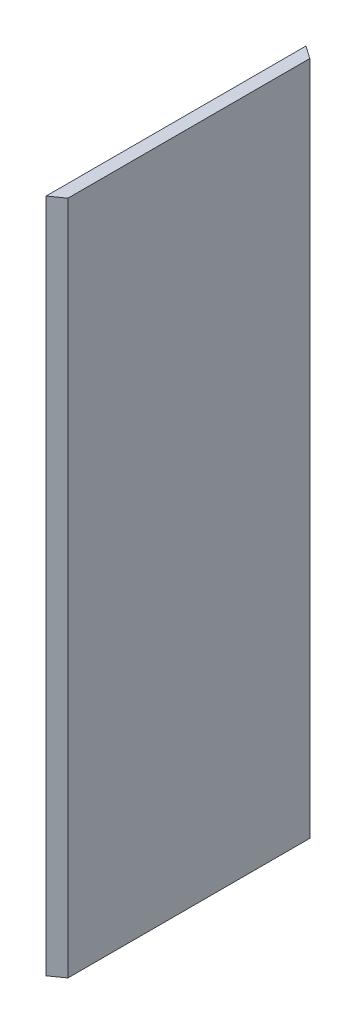
ISO-10303-21;
HEADER;
FILE_DESCRIPTION(('STEP AP214'),'2;1');
FILE_NAME('part.step','',(''),(''),'','','');
FILE_SCHEMA(('AUTOMOTIVE_DESIGN { 1 0 10303 214 1 1 1 1 }'));
ENDSEC;
DATA;
#1=APPLICATION_CONTEXT('core data for automotive mechanical design processes');
#2=APPLICATION_PROTOCOL_DEFINITION('international standard','automotive_design',2000,#1);
#3=PRODUCT_CONTEXT('',#1,'mechanical');
#4=PRODUCT('Part','Part','',(#3));
#5=PRODUCT_RELATED_PRODUCT_CATEGORY('part','',(#4));
#6=PRODUCT_DEFINITION_FORMATION('','',#4);
#7=PRODUCT_DEFINITION_CONTEXT('part definition',#1,'design');
#8=PRODUCT_DEFINITION('design','',#6,#7);
#9=PRODUCT_DEFINITION_SHAPE('','',#8);
#10=(LENGTH_UNIT() NAMED_UNIT(*) SI_UNIT(.MILLI.,.METRE.));
#11=(NAMED_UNIT(*) PLANE_ANGLE_UNIT() SI_UNIT($,.RADIAN.));
#12=(NAMED_UNIT(*) SI_UNIT($,.STERADIAN.) SOLID_ANGLE_UNIT());
#13=UNCERTAINTY_MEASURE_WITH_UNIT(LENGTH_MEASURE(1.E-05),#10,'distance_accuracy_value','');
#14=(GEOMETRIC_REPRESENTATION_CONTEXT(3) GLOBAL_UNCERTAINTY_ASSIGNED_CONTEXT((#13)) GLOBAL_UNIT_ASSIGNED_CONTEXT((#10,
#11,#12)) REPRESENTATION_CONTEXT('',''));
#15=CARTESIAN_POINT('',(0.,0.,0.));
#16=DIRECTION('',(0.,0.,1.));
#17=DIRECTION('',(1.,0.,0.));
#18=AXIS2_PLACEMENT_3D('',#15,#16,#17);
#19=CARTESIAN_POINT('',(0.245745613286697,13.,-0.172072930905315));
#20=DIRECTION('',(-0.57357643635105,0.,-0.819152044288989));
#21=DIRECTION('',(-0.819152044288989,0.,0.57357643635105));
#22=AXIS2_PLACEMENT_3D('',#19,#20,#21);
#23=PLANE('',#22);
#24=DIRECTION('',(0.819152044288989,0.,-0.57357643635105));
#25=VECTOR('',#24,1.);
#26=CARTESIAN_POINT('',(0.245745613286697,0.,-0.172072930905315));
#27=LINE('',#26,#25);
#28=CARTESIAN_POINT('',(0.,0.,0.));
#29=VERTEX_POINT('',#28);
#30=CARTESIAN_POINT('',(0.245745613286697,0.,-0.172072930905315));
#31=VERTEX_POINT('',#30);
#32=EDGE_CURVE('E113',#29,#31,#27,.T.);
#33=ORIENTED_EDGE('',*,*,#32,.T.);
#34=DIRECTION('',(0.,-1.,0.));
#35=VECTOR('',#34,1.);
#36=CARTESIAN_POINT('',(0.245745613286697,13.,-0.172072930905315));
#37=LINE('',#36,#35);
#38=CARTESIAN_POINT('',(0.245745613286697,13.,-0.172072930905315));
#39=VERTEX_POINT('',#38);
#40=EDGE_CURVE('E11',#39,#31,#37,.T.);
#41=ORIENTED_EDGE('',*,*,#40,.F.);
#42=DIRECTION('',(0.819152044288989,0.,-0.57357643635105));
#43=VECTOR('',#42,1.);
#44=CARTESIAN_POINT('',(0.245745613286697,13.,-0.172072930905315));
#45=LINE('',#44,#43);
#46=CARTESIAN_POINT('',(0.,13.,0.));
#47=VERTEX_POINT('',#46);
#48=EDGE_CURVE('E97',#47,#39,#45,.T.);
#49=ORIENTED_EDGE('',*,*,#48,.F.);
#50=DIRECTION('',(0.,-1.,0.));
#51=VECTOR('',#50,1.);
#52=CARTESIAN_POINT('',(0.,13.,0.));
#53=LINE('',#52,#51);
#54=EDGE_CURVE('E109',#47,#29,#53,.T.);
#55=ORIENTED_EDGE('',*,*,#54,.T.);
#56=EDGE_LOOP('',(#33,#41,#49,#55));
#57=FACE_BOUND('',#56,.T.);
#58=ADVANCED_FACE('F39',(#57),#23,.F.);
#59=CARTESIAN_POINT('',(0.245745613286697,13.,-4.82792706909468));
#60=DIRECTION('',(-1.,0.,0.));
#61=DIRECTION('',(0.,0.,1.));
#62=AXIS2_PLACEMENT_3D('',#59,#60,#61);
#63=PLANE('',#62);
#64=DIRECTION('',(0.,0.,-1.));
#65=VECTOR('',#64,1.);
#66=CARTESIAN_POINT('',(0.245745613286697,0.,-4.82792706909468));
#67=LINE('',#66,#65);
#68=CARTESIAN_POINT('',(0.245745613286697,0.,-4.82792706909468));
#69=VERTEX_POINT('',#68);
#70=EDGE_CURVE('E102',#31,#69,#67,.T.);
#71=ORIENTED_EDGE('',*,*,#70,.T.);
#72=DIRECTION('',(0.,-1.,0.));
#73=VECTOR('',#72,1.);
#74=CARTESIAN_POINT('',(0.245745613286697,13.,-4.82792706909468));
#75=LINE('',#74,#73);
#76=CARTESIAN_POINT('',(0.245745613286697,13.,-4.82792706909468));
#77=VERTEX_POINT('',#76);
#78=EDGE_CURVE('E48',#77,#69,#75,.T.);
#79=ORIENTED_EDGE('',*,*,#78,.F.);
#80=DIRECTION('',(0.,0.,-1.));
#81=VECTOR('',#80,1.);
#82=CARTESIAN_POINT('',(0.245745613286697,13.,-4.82792706909468));
#83=LINE('',#82,#81);
#84=EDGE_CURVE('E92',#39,#77,#83,.T.);
#85=ORIENTED_EDGE('',*,*,#84,.F.);
#86=ORIENTED_EDGE('',*,*,#40,.T.);
#87=EDGE_LOOP('',(#71,#79,#85,#86));
#88=FACE_BOUND('',#87,.T.);
#89=ADVANCED_FACE('F101',(#88),#63,.F.);
#90=CARTESIAN_POINT('',(0.,13.,-5.));
#91=DIRECTION('',(-0.57357643635105,0.,0.819152044288989));
#92=DIRECTION('',(0.819152044288989,0.,0.57357643635105));
#93=AXIS2_PLACEMENT_3D('',#90,#91,#92);
#94=PLANE('',#93);
#95=DIRECTION('',(-0.819152044288989,0.,-0.57357643635105));
#96=VECTOR('',#95,1.);
#97=CARTESIAN_POINT('',(0.,0.,-5.));
#98=LINE('',#97,#96);
#99=CARTESIAN_POINT('',(0.,0.,-5.));
#100=VERTEX_POINT('',#99);
#101=EDGE_CURVE('E77',#69,#100,#98,.T.);
#102=ORIENTED_EDGE('',*,*,#101,.T.);
#103=DIRECTION('',(0.,-1.,0.));
#104=VECTOR('',#103,1.);
#105=CARTESIAN_POINT('',(0.,13.,-5.));
#106=LINE('',#105,#104);
#107=CARTESIAN_POINT('',(0.,13.,-5.));
#108=VERTEX_POINT('',#107);
#109=EDGE_CURVE('E104',#108,#100,#106,.T.);
#110=ORIENTED_EDGE('',*,*,#109,.F.);
#111=DIRECTION('',(-0.819152044288989,0.,-0.57357643635105));
#112=VECTOR('',#111,1.);
#113=CARTESIAN_POINT('',(0.,13.,-5.));
#114=LINE('',#113,#112);
#115=EDGE_CURVE('E95',#77,#108,#114,.T.);
#116=ORIENTED_EDGE('',*,*,#115,.F.);
#117=ORIENTED_EDGE('',*,*,#78,.T.);
#118=EDGE_LOOP('',(#102,#110,#116,#117));
#119=FACE_BOUND('',#118,.T.);
#120=ADVANCED_FACE('F105',(#119),#94,.F.);
#121=CARTESIAN_POINT('',(0.,13.,0.));
#122=DIRECTION('',(1.,0.,0.));
#123=DIRECTION('',(0.,0.,-1.));
#124=AXIS2_PLACEMENT_3D('',#121,#122,#123);
#125=PLANE('',#124);
#126=DIRECTION('',(0.,0.,1.));
#127=VECTOR('',#126,1.);
#128=CARTESIAN_POINT('',(0.,0.,0.));
#129=LINE('',#128,#127);
#130=EDGE_CURVE('E85',#100,#29,#129,.T.);
#131=ORIENTED_EDGE('',*,*,#130,.T.);
#132=ORIENTED_EDGE('',*,*,#54,.F.);
#133=DIRECTION('',(0.,0.,1.));
#134=VECTOR('',#133,1.);
#135=CARTESIAN_POINT('',(0.,13.,0.));
#136=LINE('',#135,#134);
#137=EDGE_CURVE('E56',#108,#47,#136,.T.);
#138=ORIENTED_EDGE('',*,*,#137,.F.);
#139=ORIENTED_EDGE('',*,*,#109,.T.);
#140=EDGE_LOOP('',(#131,#132,#138,#139));
#141=FACE_BOUND('',#140,.T.);
#142=ADVANCED_FACE('F126',(#141),#125,.F.);
#143=CARTESIAN_POINT('',(0.,13.,0.));
#144=DIRECTION('',(0.,1.,0.));
#145=DIRECTION('',(0.,0.,1.));
#146=AXIS2_PLACEMENT_3D('',#143,#144,#145);
#147=PLANE('',#146);
#148=ORIENTED_EDGE('',*,*,#48,.T.);
#149=ORIENTED_EDGE('',*,*,#84,.T.);
#150=ORIENTED_EDGE('',*,*,#115,.T.);
#151=ORIENTED_EDGE('',*,*,#137,.T.);
#152=EDGE_LOOP('',(#148,#149,#150,#151));
#153=FACE_BOUND('',#152,.T.);
#154=ADVANCED_FACE('F93',(#153),#147,.T.);
#155=CARTESIAN_POINT('',(0.,0.,0.));
#156=DIRECTION('',(0.,1.,0.));
#157=DIRECTION('',(0.,0.,1.));
#158=AXIS2_PLACEMENT_3D('',#155,#156,#157);
#159=PLANE('',#158);
#160=ORIENTED_EDGE('',*,*,#32,.F.);
#161=ORIENTED_EDGE('',*,*,#130,.F.);
#162=ORIENTED_EDGE('',*,*,#101,.F.);
#163=ORIENTED_EDGE('',*,*,#70,.F.);
#164=EDGE_LOOP('',(#160,#161,#162,#163));
#165=FACE_BOUND('',#164,.T.);
#166=ADVANCED_FACE('F129',(#165),#159,.F.);
#167=CLOSED_SHELL('',(#58,#89,#120,#142,#154,#166));
#168=MANIFOLD_SOLID_BREP('B2',#167);
#169=ADVANCED_BREP_SHAPE_REPRESENTATION('',(#18,#168),#14);
#170=SHAPE_DEFINITION_REPRESENTATION(#9,#169);
ENDSEC;
END-ISO-10303-21;
